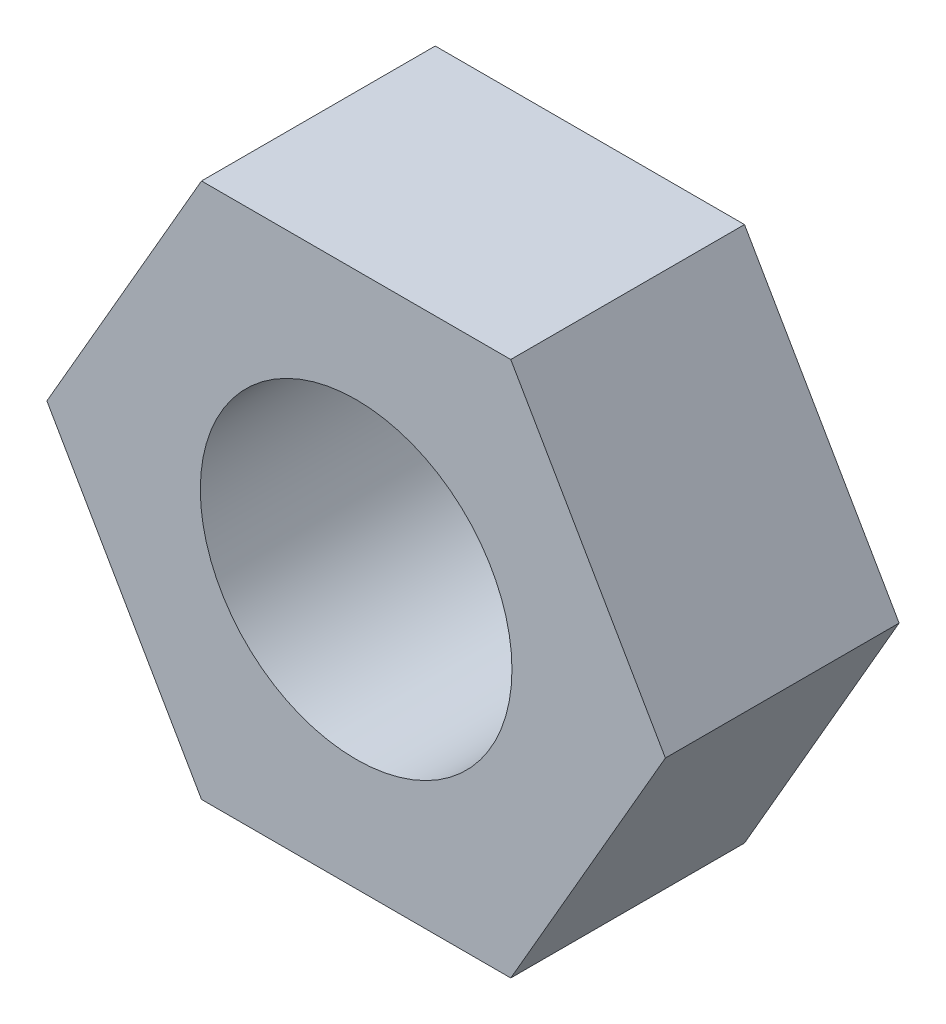
ISO-10303-21;
HEADER;
FILE_DESCRIPTION(('STEP AP214'),'2;1');
FILE_NAME('part.step','',(''),(''),'','','');
FILE_SCHEMA(('AUTOMOTIVE_DESIGN { 1 0 10303 214 1 1 1 1 }'));
ENDSEC;
DATA;
#1=APPLICATION_CONTEXT('core data for automotive mechanical design processes');
#2=APPLICATION_PROTOCOL_DEFINITION('international standard','automotive_design',2000,#1);
#3=PRODUCT_CONTEXT('',#1,'mechanical');
#4=PRODUCT('Part','Part','',(#3));
#5=PRODUCT_RELATED_PRODUCT_CATEGORY('part','',(#4));
#6=PRODUCT_DEFINITION_FORMATION('','',#4);
#7=PRODUCT_DEFINITION_CONTEXT('part definition',#1,'design');
#8=PRODUCT_DEFINITION('design','',#6,#7);
#9=PRODUCT_DEFINITION_SHAPE('','',#8);
#10=(LENGTH_UNIT() NAMED_UNIT(*) SI_UNIT(.MILLI.,.METRE.));
#11=(NAMED_UNIT(*) PLANE_ANGLE_UNIT() SI_UNIT($,.RADIAN.));
#12=(NAMED_UNIT(*) SI_UNIT($,.STERADIAN.) SOLID_ANGLE_UNIT());
#13=UNCERTAINTY_MEASURE_WITH_UNIT(LENGTH_MEASURE(1.E-05),#10,'distance_accuracy_value','');
#14=(GEOMETRIC_REPRESENTATION_CONTEXT(3) GLOBAL_UNCERTAINTY_ASSIGNED_CONTEXT((#13)) GLOBAL_UNIT_ASSIGNED_CONTEXT((#10,
#11,#12)) REPRESENTATION_CONTEXT('',''));
#15=CARTESIAN_POINT('',(0.,0.,0.));
#16=DIRECTION('',(0.,0.,1.));
#17=DIRECTION('',(1.,0.,0.));
#18=AXIS2_PLACEMENT_3D('',#15,#16,#17);
#19=CARTESIAN_POINT('',(0.,0.,1.2));
#20=DIRECTION('',(0.,0.,1.));
#21=DIRECTION('',(1.,0.,0.));
#22=AXIS2_PLACEMENT_3D('',#19,#20,#21);
#23=PLANE('',#22);
#24=DIRECTION('',(0.499999999999995,0.866025403784441,0.));
#25=VECTOR('',#24,1.);
#26=CARTESIAN_POINT('',(1.5877132402715,-2.74999999999998,1.2));
#27=LINE('',#26,#25);
#28=CARTESIAN_POINT('',(1.5877132402715,-2.74999999999998,1.2));
#29=VERTEX_POINT('',#28);
#30=CARTESIAN_POINT('',(3.17542648054294,0.,1.2));
#31=VERTEX_POINT('',#30);
#32=EDGE_CURVE('E145',#29,#31,#27,.T.);
#33=ORIENTED_EDGE('',*,*,#32,.T.);
#34=DIRECTION('',(-0.500000000000001,0.866025403784438,0.));
#35=VECTOR('',#34,1.);
#36=CARTESIAN_POINT('',(3.17542648054294,0.,1.2));
#37=LINE('',#36,#35);
#38=CARTESIAN_POINT('',(1.58771324027146,2.75,1.2));
#39=VERTEX_POINT('',#38);
#40=EDGE_CURVE('E105',#31,#39,#37,.T.);
#41=ORIENTED_EDGE('',*,*,#40,.T.);
#42=DIRECTION('',(-1.,0.,0.));
#43=VECTOR('',#42,1.);
#44=CARTESIAN_POINT('',(1.58771324027146,2.75,1.2));
#45=LINE('',#44,#43);
#46=CARTESIAN_POINT('',(-1.58771324027148,2.74999999999999,1.2));
#47=VERTEX_POINT('',#46);
#48=EDGE_CURVE('E113',#39,#47,#45,.T.);
#49=ORIENTED_EDGE('',*,*,#48,.T.);
#50=DIRECTION('',(-0.499999999999995,-0.866025403784442,0.));
#51=VECTOR('',#50,1.);
#52=CARTESIAN_POINT('',(-1.58771324027148,2.74999999999999,1.2));
#53=LINE('',#52,#51);
#54=CARTESIAN_POINT('',(-3.17542648054294,0.,1.2));
#55=VERTEX_POINT('',#54);
#56=EDGE_CURVE('E108',#47,#55,#53,.T.);
#57=ORIENTED_EDGE('',*,*,#56,.T.);
#58=DIRECTION('',(0.500000000000007,-0.866025403784434,0.));
#59=VECTOR('',#58,1.);
#60=CARTESIAN_POINT('',(-3.17542648054294,0.,1.2));
#61=LINE('',#60,#59);
#62=CARTESIAN_POINT('',(-1.58771324027144,-2.75000000000001,1.2));
#63=VERTEX_POINT('',#62);
#64=EDGE_CURVE('E114',#55,#63,#61,.T.);
#65=ORIENTED_EDGE('',*,*,#64,.T.);
#66=DIRECTION('',(1.,0.,0.));
#67=VECTOR('',#66,1.);
#68=CARTESIAN_POINT('',(-1.58771324027144,-2.75000000000001,1.2));
#69=LINE('',#68,#67);
#70=EDGE_CURVE('E62',#63,#29,#69,.T.);
#71=ORIENTED_EDGE('',*,*,#70,.T.);
#72=EDGE_LOOP('',(#33,#41,#49,#57,#65,#71));
#73=FACE_BOUND('',#72,.T.);
#74=CARTESIAN_POINT('',(0.,0.,1.2));
#75=DIRECTION('',(0.,0.,1.));
#76=DIRECTION('',(1.,0.,0.));
#77=AXIS2_PLACEMENT_3D('',#74,#75,#76);
#78=CIRCLE('',#77,1.6);
#79=CARTESIAN_POINT('',(1.6,0.,1.2));
#80=VERTEX_POINT('',#79);
#81=EDGE_CURVE('E140',#80,#80,#78,.T.);
#82=ORIENTED_EDGE('',*,*,#81,.F.);
#83=EDGE_LOOP('',(#82));
#84=FACE_BOUND('',#83,.T.);
#85=ADVANCED_FACE('F50',(#73,#84),#23,.T.);
#86=CARTESIAN_POINT('',(0.,0.,-1.2));
#87=DIRECTION('',(0.,0.,1.));
#88=DIRECTION('',(1.,0.,0.));
#89=AXIS2_PLACEMENT_3D('',#86,#87,#88);
#90=PLANE('',#89);
#91=DIRECTION('',(0.499999999999995,0.866025403784441,0.));
#92=VECTOR('',#91,1.);
#93=CARTESIAN_POINT('',(1.5877132402715,-2.74999999999998,-1.2));
#94=LINE('',#93,#92);
#95=CARTESIAN_POINT('',(1.5877132402715,-2.74999999999998,-1.2));
#96=VERTEX_POINT('',#95);
#97=CARTESIAN_POINT('',(3.17542648054294,0.,-1.2));
#98=VERTEX_POINT('',#97);
#99=EDGE_CURVE('E131',#96,#98,#94,.T.);
#100=ORIENTED_EDGE('',*,*,#99,.F.);
#101=DIRECTION('',(1.,0.,0.));
#102=VECTOR('',#101,1.);
#103=CARTESIAN_POINT('',(-1.58771324027144,-2.75000000000001,-1.2));
#104=LINE('',#103,#102);
#105=CARTESIAN_POINT('',(-1.58771324027144,-2.75000000000001,-1.2));
#106=VERTEX_POINT('',#105);
#107=EDGE_CURVE('E94',#106,#96,#104,.T.);
#108=ORIENTED_EDGE('',*,*,#107,.F.);
#109=DIRECTION('',(0.500000000000007,-0.866025403784434,0.));
#110=VECTOR('',#109,1.);
#111=CARTESIAN_POINT('',(-3.17542648054294,0.,-1.2));
#112=LINE('',#111,#110);
#113=CARTESIAN_POINT('',(-3.17542648054294,0.,-1.2));
#114=VERTEX_POINT('',#113);
#115=EDGE_CURVE('E86',#114,#106,#112,.T.);
#116=ORIENTED_EDGE('',*,*,#115,.F.);
#117=DIRECTION('',(-0.499999999999995,-0.866025403784442,0.));
#118=VECTOR('',#117,1.);
#119=CARTESIAN_POINT('',(-1.58771324027148,2.74999999999999,-1.2));
#120=LINE('',#119,#118);
#121=CARTESIAN_POINT('',(-1.58771324027148,2.74999999999999,-1.2));
#122=VERTEX_POINT('',#121);
#123=EDGE_CURVE('E123',#122,#114,#120,.T.);
#124=ORIENTED_EDGE('',*,*,#123,.F.);
#125=DIRECTION('',(-1.,0.,0.));
#126=VECTOR('',#125,1.);
#127=CARTESIAN_POINT('',(1.58771324027146,2.75,-1.2));
#128=LINE('',#127,#126);
#129=CARTESIAN_POINT('',(1.58771324027146,2.75,-1.2));
#130=VERTEX_POINT('',#129);
#131=EDGE_CURVE('E139',#130,#122,#128,.T.);
#132=ORIENTED_EDGE('',*,*,#131,.F.);
#133=DIRECTION('',(-0.500000000000001,0.866025403784438,0.));
#134=VECTOR('',#133,1.);
#135=CARTESIAN_POINT('',(3.17542648054294,0.,-1.2));
#136=LINE('',#135,#134);
#137=EDGE_CURVE('E137',#98,#130,#136,.T.);
#138=ORIENTED_EDGE('',*,*,#137,.F.);
#139=EDGE_LOOP('',(#100,#108,#116,#124,#132,#138));
#140=FACE_BOUND('',#139,.T.);
#141=CARTESIAN_POINT('',(0.,0.,-1.2));
#142=DIRECTION('',(0.,0.,1.));
#143=DIRECTION('',(1.,0.,0.));
#144=AXIS2_PLACEMENT_3D('',#141,#142,#143);
#145=CIRCLE('',#144,1.6);
#146=CARTESIAN_POINT('',(1.6,0.,-1.2));
#147=VERTEX_POINT('',#146);
#148=EDGE_CURVE('E306',#147,#147,#145,.T.);
#149=ORIENTED_EDGE('',*,*,#148,.T.);
#150=EDGE_LOOP('',(#149));
#151=FACE_BOUND('',#150,.T.);
#152=ADVANCED_FACE('F153',(#140,#151),#90,.F.);
#153=CARTESIAN_POINT('',(1.5877132402715,-2.74999999999998,1.2));
#154=DIRECTION('',(-0.866025403784441,0.499999999999995,0.));
#155=DIRECTION('',(-0.499999999999995,-0.866025403784442,0.));
#156=AXIS2_PLACEMENT_3D('',#153,#154,#155);
#157=PLANE('',#156);
#158=ORIENTED_EDGE('',*,*,#99,.T.);
#159=DIRECTION('',(0.,0.,-1.));
#160=VECTOR('',#159,1.);
#161=CARTESIAN_POINT('',(3.17542648054294,0.,1.2));
#162=LINE('',#161,#160);
#163=EDGE_CURVE('E11',#31,#98,#162,.T.);
#164=ORIENTED_EDGE('',*,*,#163,.F.);
#165=ORIENTED_EDGE('',*,*,#32,.F.);
#166=DIRECTION('',(0.,0.,-1.));
#167=VECTOR('',#166,1.);
#168=CARTESIAN_POINT('',(1.5877132402715,-2.74999999999998,1.2));
#169=LINE('',#168,#167);
#170=EDGE_CURVE('E129',#29,#96,#169,.T.);
#171=ORIENTED_EDGE('',*,*,#170,.T.);
#172=EDGE_LOOP('',(#158,#164,#165,#171));
#173=FACE_BOUND('',#172,.T.);
#174=ADVANCED_FACE('F49',(#173),#157,.F.);
#175=CARTESIAN_POINT('',(3.17542648054294,0.,1.2));
#176=DIRECTION('',(-0.866025403784438,-0.500000000000001,0.));
#177=DIRECTION('',(0.500000000000001,-0.866025403784438,0.));
#178=AXIS2_PLACEMENT_3D('',#175,#176,#177);
#179=PLANE('',#178);
#180=ORIENTED_EDGE('',*,*,#137,.T.);
#181=DIRECTION('',(0.,0.,-1.));
#182=VECTOR('',#181,1.);
#183=CARTESIAN_POINT('',(1.58771324027146,2.75,1.2));
#184=LINE('',#183,#182);
#185=EDGE_CURVE('E60',#39,#130,#184,.T.);
#186=ORIENTED_EDGE('',*,*,#185,.F.);
#187=ORIENTED_EDGE('',*,*,#40,.F.);
#188=ORIENTED_EDGE('',*,*,#163,.T.);
#189=EDGE_LOOP('',(#180,#186,#187,#188));
#190=FACE_BOUND('',#189,.T.);
#191=ADVANCED_FACE('F176',(#190),#179,.F.);
#192=CARTESIAN_POINT('',(1.58771324027146,2.75,1.2));
#193=DIRECTION('',(0.,-1.,0.));
#194=DIRECTION('',(1.,0.,0.));
#195=AXIS2_PLACEMENT_3D('',#192,#193,#194);
#196=PLANE('',#195);
#197=ORIENTED_EDGE('',*,*,#131,.T.);
#198=DIRECTION('',(0.,0.,-1.));
#199=VECTOR('',#198,1.);
#200=CARTESIAN_POINT('',(-1.58771324027148,2.74999999999999,1.2));
#201=LINE('',#200,#199);
#202=EDGE_CURVE('E124',#47,#122,#201,.T.);
#203=ORIENTED_EDGE('',*,*,#202,.F.);
#204=ORIENTED_EDGE('',*,*,#48,.F.);
#205=ORIENTED_EDGE('',*,*,#185,.T.);
#206=EDGE_LOOP('',(#197,#203,#204,#205));
#207=FACE_BOUND('',#206,.T.);
#208=ADVANCED_FACE('F147',(#207),#196,.F.);
#209=CARTESIAN_POINT('',(-1.58771324027148,2.74999999999999,1.2));
#210=DIRECTION('',(0.866025403784441,-0.499999999999995,0.));
#211=DIRECTION('',(0.499999999999995,0.866025403784442,0.));
#212=AXIS2_PLACEMENT_3D('',#209,#210,#211);
#213=PLANE('',#212);
#214=ORIENTED_EDGE('',*,*,#123,.T.);
#215=DIRECTION('',(0.,0.,-1.));
#216=VECTOR('',#215,1.);
#217=CARTESIAN_POINT('',(-3.17542648054294,0.,1.2));
#218=LINE('',#217,#216);
#219=EDGE_CURVE('E117',#55,#114,#218,.T.);
#220=ORIENTED_EDGE('',*,*,#219,.F.);
#221=ORIENTED_EDGE('',*,*,#56,.F.);
#222=ORIENTED_EDGE('',*,*,#202,.T.);
#223=EDGE_LOOP('',(#214,#220,#221,#222));
#224=FACE_BOUND('',#223,.T.);
#225=ADVANCED_FACE('F122',(#224),#213,.F.);
#226=CARTESIAN_POINT('',(-3.17542648054294,0.,1.2));
#227=DIRECTION('',(0.866025403784434,0.500000000000007,0.));
#228=DIRECTION('',(-0.500000000000007,0.866025403784435,0.));
#229=AXIS2_PLACEMENT_3D('',#226,#227,#228);
#230=PLANE('',#229);
#231=ORIENTED_EDGE('',*,*,#115,.T.);
#232=DIRECTION('',(0.,0.,-1.));
#233=VECTOR('',#232,1.);
#234=CARTESIAN_POINT('',(-1.58771324027144,-2.75000000000001,1.2));
#235=LINE('',#234,#233);
#236=EDGE_CURVE('E121',#63,#106,#235,.T.);
#237=ORIENTED_EDGE('',*,*,#236,.F.);
#238=ORIENTED_EDGE('',*,*,#64,.F.);
#239=ORIENTED_EDGE('',*,*,#219,.T.);
#240=EDGE_LOOP('',(#231,#237,#238,#239));
#241=FACE_BOUND('',#240,.T.);
#242=ADVANCED_FACE('F130',(#241),#230,.F.);
#243=CARTESIAN_POINT('',(-1.58771324027144,-2.75000000000001,1.2));
#244=DIRECTION('',(0.,1.,0.));
#245=DIRECTION('',(-1.,0.,0.));
#246=AXIS2_PLACEMENT_3D('',#243,#244,#245);
#247=PLANE('',#246);
#248=ORIENTED_EDGE('',*,*,#107,.T.);
#249=ORIENTED_EDGE('',*,*,#170,.F.);
#250=ORIENTED_EDGE('',*,*,#70,.F.);
#251=ORIENTED_EDGE('',*,*,#236,.T.);
#252=EDGE_LOOP('',(#248,#249,#250,#251));
#253=FACE_BOUND('',#252,.T.);
#254=ADVANCED_FACE('F158',(#253),#247,.F.);
#255=CARTESIAN_POINT('',(0.,0.,1.2));
#256=DIRECTION('',(0.,0.,-1.));
#257=DIRECTION('',(-1.,0.,0.));
#258=AXIS2_PLACEMENT_3D('',#255,#256,#257);
#259=CYLINDRICAL_SURFACE('',#258,1.6);
#260=ORIENTED_EDGE('',*,*,#81,.T.);
#261=EDGE_LOOP('',(#260));
#262=FACE_BOUND('',#261,.T.);
#263=ORIENTED_EDGE('',*,*,#148,.F.);
#264=EDGE_LOOP('',(#263));
#265=FACE_BOUND('',#264,.T.);
#266=ADVANCED_FACE('F159',(#262,#265),#259,.F.);
#267=CLOSED_SHELL('',(#85,#152,#174,#191,#208,#225,#242,#254,#266));
#268=MANIFOLD_SOLID_BREP('B2',#267);
#269=ADVANCED_BREP_SHAPE_REPRESENTATION('',(#18,#268),#14);
#270=SHAPE_DEFINITION_REPRESENTATION(#9,#269);
ENDSEC;
END-ISO-10303-21;
